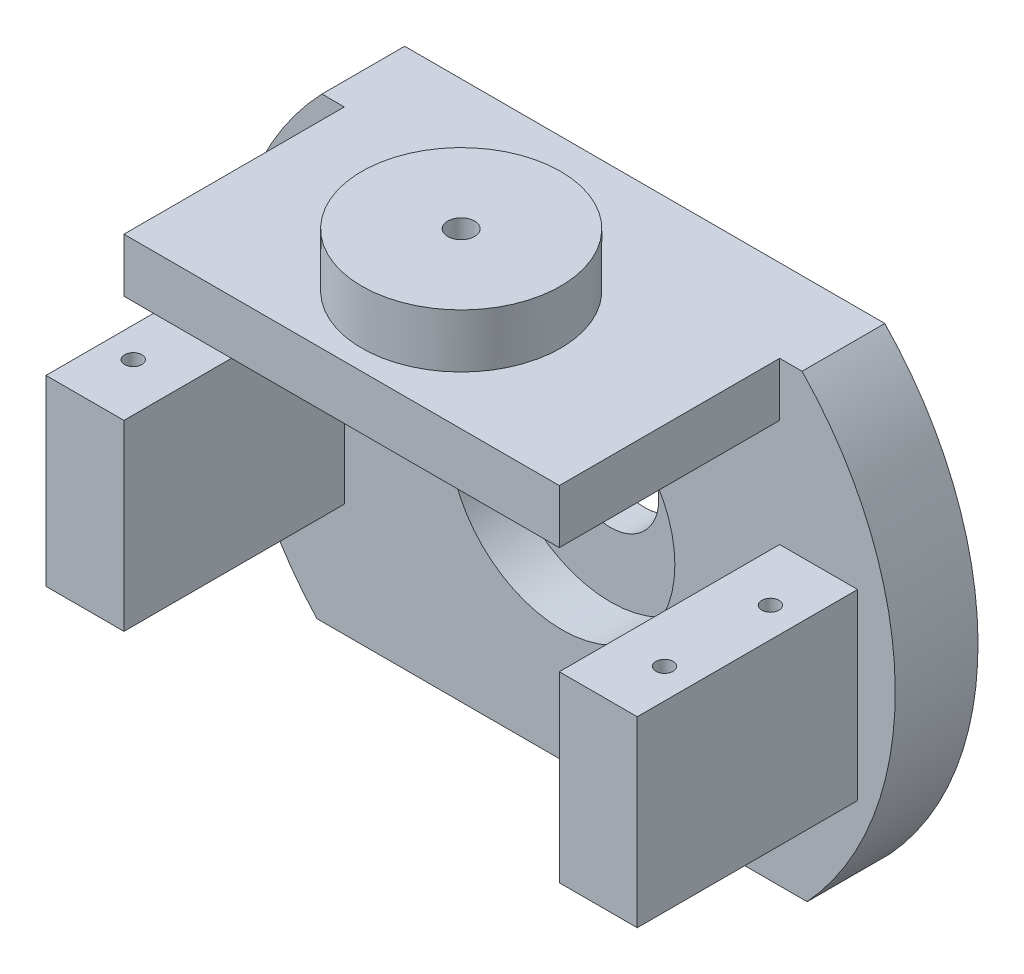
ISO-10303-21;
HEADER;
FILE_DESCRIPTION(('STEP AP214'),'2;1');
FILE_NAME('part.step','',(''),(''),'','','');
FILE_SCHEMA(('AUTOMOTIVE_DESIGN { 1 0 10303 214 1 1 1 1 }'));
ENDSEC;
DATA;
#1=APPLICATION_CONTEXT('core data for automotive mechanical design processes');
#2=APPLICATION_PROTOCOL_DEFINITION('international standard','automotive_design',2000,#1);
#3=PRODUCT_CONTEXT('',#1,'mechanical');
#4=PRODUCT('Part','Part','',(#3));
#5=PRODUCT_RELATED_PRODUCT_CATEGORY('part','',(#4));
#6=PRODUCT_DEFINITION_FORMATION('','',#4);
#7=PRODUCT_DEFINITION_CONTEXT('part definition',#1,'design');
#8=PRODUCT_DEFINITION('design','',#6,#7);
#9=PRODUCT_DEFINITION_SHAPE('','',#8);
#10=(LENGTH_UNIT() NAMED_UNIT(*) SI_UNIT(.MILLI.,.METRE.));
#11=(NAMED_UNIT(*) PLANE_ANGLE_UNIT() SI_UNIT($,.RADIAN.));
#12=(NAMED_UNIT(*) SI_UNIT($,.STERADIAN.) SOLID_ANGLE_UNIT());
#13=UNCERTAINTY_MEASURE_WITH_UNIT(LENGTH_MEASURE(1.E-05),#10,'distance_accuracy_value','');
#14=(GEOMETRIC_REPRESENTATION_CONTEXT(3) GLOBAL_UNCERTAINTY_ASSIGNED_CONTEXT((#13)) GLOBAL_UNIT_ASSIGNED_CONTEXT((#10,
#11,#12)) REPRESENTATION_CONTEXT('',''));
#15=CARTESIAN_POINT('',(0.,0.,0.));
#16=DIRECTION('',(0.,0.,1.));
#17=DIRECTION('',(1.,0.,0.));
#18=AXIS2_PLACEMENT_3D('',#15,#16,#17);
#19=CARTESIAN_POINT('',(0.,0.,94.1812408671319));
#20=DIRECTION('',(0.,0.,-1.));
#21=DIRECTION('',(-1.,0.,0.));
#22=AXIS2_PLACEMENT_3D('',#19,#20,#21);
#23=CYLINDRICAL_SURFACE('',#22,31.);
#24=DIRECTION('',(0.,0.,-1.));
#25=VECTOR('',#24,1.);
#26=CARTESIAN_POINT('',(-22.8035085019828,-21.,94.1812408671319));
#27=LINE('',#26,#25);
#28=CARTESIAN_POINT('',(-22.8035085019828,-21.,6.5));
#29=VERTEX_POINT('',#28);
#30=CARTESIAN_POINT('',(-22.8035085019828,-21.,-1.2));
#31=VERTEX_POINT('',#30);
#32=EDGE_CURVE('E60',#29,#31,#27,.T.);
#33=ORIENTED_EDGE('',*,*,#32,.F.);
#34=CARTESIAN_POINT('',(0.,0.,6.50000000000001));
#35=DIRECTION('',(0.,0.,-1.));
#36=DIRECTION('',(-1.,0.,0.));
#37=AXIS2_PLACEMENT_3D('',#34,#35,#36);
#38=CIRCLE('',#37,31.);
#39=CARTESIAN_POINT('',(-22.3327114341273,21.5,6.50000000000001));
#40=VERTEX_POINT('',#39);
#41=EDGE_CURVE('E229',#40,#29,#38,.F.);
#42=ORIENTED_EDGE('',*,*,#41,.F.);
#43=DIRECTION('',(0.,0.,-1.));
#44=VECTOR('',#43,1.);
#45=CARTESIAN_POINT('',(-22.3327114341273,21.5,94.1812408671319));
#46=LINE('',#45,#44);
#47=CARTESIAN_POINT('',(-22.3327114341273,21.5,-1.2));
#48=VERTEX_POINT('',#47);
#49=EDGE_CURVE('E54',#48,#40,#46,.F.);
#50=ORIENTED_EDGE('',*,*,#49,.F.);
#51=CARTESIAN_POINT('',(0.,0.,-1.2));
#52=DIRECTION('',(0.,0.,-1.));
#53=DIRECTION('',(-1.,0.,0.));
#54=AXIS2_PLACEMENT_3D('',#51,#52,#53);
#55=CIRCLE('',#54,31.);
#56=EDGE_CURVE('E168',#31,#48,#55,.T.);
#57=ORIENTED_EDGE('',*,*,#56,.F.);
#58=EDGE_LOOP('',(#33,#42,#50,#57));
#59=FACE_BOUND('',#58,.T.);
#60=ADVANCED_FACE('F45',(#59),#23,.T.);
#61=CARTESIAN_POINT('',(-20.25,67.4360851344404,6.5));
#62=DIRECTION('',(0.,0.,-1.));
#63=DIRECTION('',(-1.,0.,0.));
#64=AXIS2_PLACEMENT_3D('',#61,#62,#63);
#65=PLANE('',#64);
#66=CARTESIAN_POINT('',(0.,0.,6.5));
#67=DIRECTION('',(0.,0.,1.));
#68=DIRECTION('',(1.,0.,0.));
#69=AXIS2_PLACEMENT_3D('',#66,#67,#68);
#70=CIRCLE('',#69,10.5);
#71=CARTESIAN_POINT('',(10.5,0.,6.5));
#72=VERTEX_POINT('',#71);
#73=EDGE_CURVE('E201',#72,#72,#70,.T.);
#74=ORIENTED_EDGE('',*,*,#73,.F.);
#75=EDGE_LOOP('',(#74));
#76=FACE_BOUND('',#75,.T.);
#77=DIRECTION('',(-1.,0.,0.));
#78=VECTOR('',#77,1.);
#79=CARTESIAN_POINT('',(50.3089894559141,6.50000000000001,6.5));
#80=LINE('',#79,#78);
#81=CARTESIAN_POINT('',(27.5,6.50000000000001,6.5));
#82=VERTEX_POINT('',#81);
#83=CARTESIAN_POINT('',(20.25,6.50000000000001,6.5));
#84=VERTEX_POINT('',#83);
#85=EDGE_CURVE('E277',#82,#84,#80,.T.);
#86=ORIENTED_EDGE('',*,*,#85,.F.);
#87=DIRECTION('',(0.,-1.,0.));
#88=VECTOR('',#87,1.);
#89=CARTESIAN_POINT('',(27.5,21.5,6.5));
#90=LINE('',#89,#88);
#91=CARTESIAN_POINT('',(27.5,-10.5,6.5));
#92=VERTEX_POINT('',#91);
#93=EDGE_CURVE('E233',#82,#92,#90,.T.);
#94=ORIENTED_EDGE('',*,*,#93,.T.);
#95=DIRECTION('',(-1.,0.,0.));
#96=VECTOR('',#95,1.);
#97=CARTESIAN_POINT('',(-27.5,-10.5,6.5));
#98=LINE('',#97,#96);
#99=CARTESIAN_POINT('',(20.25,-10.5,6.5));
#100=VERTEX_POINT('',#99);
#101=EDGE_CURVE('E305',#92,#100,#98,.T.);
#102=ORIENTED_EDGE('',*,*,#101,.T.);
#103=DIRECTION('',(0.,-1.,0.));
#104=VECTOR('',#103,1.);
#105=CARTESIAN_POINT('',(20.25,67.4360851344404,6.5));
#106=LINE('',#105,#104);
#107=EDGE_CURVE('E318',#84,#100,#106,.T.);
#108=ORIENTED_EDGE('',*,*,#107,.F.);
#109=EDGE_LOOP('',(#86,#94,#102,#108));
#110=FACE_BOUND('',#109,.T.);
#111=ORIENTED_EDGE('',*,*,#41,.T.);
#112=DIRECTION('',(-1.,0.,0.));
#113=VECTOR('',#112,1.);
#114=CARTESIAN_POINT('',(26.5027413784262,-21.,6.5));
#115=LINE('',#114,#113);
#116=CARTESIAN_POINT('',(22.8035085019828,-21.,6.5));
#117=VERTEX_POINT('',#116);
#118=EDGE_CURVE('E381',#117,#29,#115,.T.);
#119=ORIENTED_EDGE('',*,*,#118,.F.);
#120=CARTESIAN_POINT('',(22.3327114341273,21.5,6.50000000000001));
#121=VERTEX_POINT('',#120);
#122=EDGE_CURVE('E68',#117,#121,#38,.F.);
#123=ORIENTED_EDGE('',*,*,#122,.T.);
#124=DIRECTION('',(1.,0.,0.));
#125=VECTOR('',#124,1.);
#126=CARTESIAN_POINT('',(-26.0407931939076,21.5,6.5));
#127=LINE('',#126,#125);
#128=CARTESIAN_POINT('',(20.25,21.5,6.5));
#129=VERTEX_POINT('',#128);
#130=EDGE_CURVE('E178',#129,#121,#127,.T.);
#131=ORIENTED_EDGE('',*,*,#130,.F.);
#132=DIRECTION('',(0.,-1.,0.));
#133=VECTOR('',#132,1.);
#134=CARTESIAN_POINT('',(20.25,43.2442521140645,6.5));
#135=LINE('',#134,#133);
#136=CARTESIAN_POINT('',(20.25,16.5,6.5));
#137=VERTEX_POINT('',#136);
#138=EDGE_CURVE('E262',#129,#137,#135,.T.);
#139=ORIENTED_EDGE('',*,*,#138,.T.);
#140=DIRECTION('',(-1.,0.,0.));
#141=VECTOR('',#140,1.);
#142=CARTESIAN_POINT('',(-20.25,16.5,6.5));
#143=LINE('',#142,#141);
#144=CARTESIAN_POINT('',(-20.25,16.5,6.5));
#145=VERTEX_POINT('',#144);
#146=EDGE_CURVE('E321',#137,#145,#143,.T.);
#147=ORIENTED_EDGE('',*,*,#146,.T.);
#148=DIRECTION('',(0.,-1.,0.));
#149=VECTOR('',#148,1.);
#150=CARTESIAN_POINT('',(-20.25,43.2442521140645,6.5));
#151=LINE('',#150,#149);
#152=CARTESIAN_POINT('',(-20.25,21.5,6.5));
#153=VERTEX_POINT('',#152);
#154=EDGE_CURVE('E250',#153,#145,#151,.T.);
#155=ORIENTED_EDGE('',*,*,#154,.F.);
#156=EDGE_CURVE('E184',#40,#153,#127,.T.);
#157=ORIENTED_EDGE('',*,*,#156,.F.);
#158=EDGE_LOOP('',(#111,#119,#123,#131,#139,#147,#155,#157));
#159=FACE_BOUND('',#158,.T.);
#160=CARTESIAN_POINT('',(-20.25,-10.5,6.5));
#161=VERTEX_POINT('',#160);
#162=CARTESIAN_POINT('',(-27.5,-10.5,6.5));
#163=VERTEX_POINT('',#162);
#164=EDGE_CURVE('E304',#161,#163,#98,.T.);
#165=ORIENTED_EDGE('',*,*,#164,.T.);
#166=DIRECTION('',(0.,1.,0.));
#167=VECTOR('',#166,1.);
#168=CARTESIAN_POINT('',(-27.5,21.5,6.5));
#169=LINE('',#168,#167);
#170=CARTESIAN_POINT('',(-27.5,6.5,6.5));
#171=VERTEX_POINT('',#170);
#172=EDGE_CURVE('E237',#163,#171,#169,.T.);
#173=ORIENTED_EDGE('',*,*,#172,.T.);
#174=CARTESIAN_POINT('',(-20.25,6.5,6.5));
#175=VERTEX_POINT('',#174);
#176=EDGE_CURVE('E270',#175,#171,#80,.T.);
#177=ORIENTED_EDGE('',*,*,#176,.F.);
#178=DIRECTION('',(0.,-1.,0.));
#179=VECTOR('',#178,1.);
#180=CARTESIAN_POINT('',(-20.25,67.4360851344404,6.5));
#181=LINE('',#180,#179);
#182=EDGE_CURVE('E317',#175,#161,#181,.T.);
#183=ORIENTED_EDGE('',*,*,#182,.T.);
#184=EDGE_LOOP('',(#165,#173,#177,#183));
#185=FACE_BOUND('',#184,.T.);
#186=ADVANCED_FACE('F377',(#76,#110,#159,#185),#65,.F.);
#187=CARTESIAN_POINT('',(27.5,21.5,27.));
#188=DIRECTION('',(-1.,0.,0.));
#189=DIRECTION('',(0.,-1.,0.));
#190=AXIS2_PLACEMENT_3D('',#187,#188,#189);
#191=PLANE('',#190);
#192=ORIENTED_EDGE('',*,*,#93,.F.);
#193=DIRECTION('',(0.,0.,-1.));
#194=VECTOR('',#193,1.);
#195=CARTESIAN_POINT('',(27.5,6.50000000000001,6.5));
#196=LINE('',#195,#194);
#197=CARTESIAN_POINT('',(27.5,6.50000000000001,27.));
#198=VERTEX_POINT('',#197);
#199=EDGE_CURVE('E275',#198,#82,#196,.T.);
#200=ORIENTED_EDGE('',*,*,#199,.F.);
#201=DIRECTION('',(0.,1.,0.));
#202=VECTOR('',#201,1.);
#203=CARTESIAN_POINT('',(27.5,21.5,27.));
#204=LINE('',#203,#202);
#205=CARTESIAN_POINT('',(27.5,-10.5,27.));
#206=VERTEX_POINT('',#205);
#207=EDGE_CURVE('E327',#206,#198,#204,.T.);
#208=ORIENTED_EDGE('',*,*,#207,.F.);
#209=DIRECTION('',(0.,0.,-1.));
#210=VECTOR('',#209,1.);
#211=CARTESIAN_POINT('',(27.5,-10.5,27.));
#212=LINE('',#211,#210);
#213=EDGE_CURVE('E291',#206,#92,#212,.T.);
#214=ORIENTED_EDGE('',*,*,#213,.T.);
#215=EDGE_LOOP('',(#192,#200,#208,#214));
#216=FACE_BOUND('',#215,.T.);
#217=ADVANCED_FACE('F47',(#216),#191,.F.);
#218=CARTESIAN_POINT('',(-27.5,21.5,27.));
#219=DIRECTION('',(0.,-1.,0.));
#220=DIRECTION('',(0.,0.,-1.));
#221=AXIS2_PLACEMENT_3D('',#218,#219,#220);
#222=PLANE('',#221);
#223=CARTESIAN_POINT('',(0.,21.5,15.8768229827015));
#224=DIRECTION('',(0.,-1.,0.));
#225=DIRECTION('',(0.,0.,-1.));
#226=AXIS2_PLACEMENT_3D('',#223,#224,#225);
#227=CIRCLE('',#226,9.25);
#228=CARTESIAN_POINT('',(0.,21.5,6.62682298270155));
#229=VERTEX_POINT('',#228);
#230=EDGE_CURVE('E349',#229,#229,#227,.F.);
#231=ORIENTED_EDGE('',*,*,#230,.F.);
#232=EDGE_LOOP('',(#231));
#233=FACE_BOUND('',#232,.T.);
#234=DIRECTION('',(0.,0.,1.));
#235=VECTOR('',#234,1.);
#236=CARTESIAN_POINT('',(20.25,21.5,27.));
#237=LINE('',#236,#235);
#238=CARTESIAN_POINT('',(20.25,21.5,27.));
#239=VERTEX_POINT('',#238);
#240=EDGE_CURVE('E251',#129,#239,#237,.T.);
#241=ORIENTED_EDGE('',*,*,#240,.F.);
#242=ORIENTED_EDGE('',*,*,#130,.T.);
#243=DIRECTION('',(0.,0.,-1.));
#244=VECTOR('',#243,1.);
#245=CARTESIAN_POINT('',(22.3327114341273,21.5,94.1812408671319));
#246=LINE('',#245,#244);
#247=CARTESIAN_POINT('',(22.3327114341273,21.5,-1.2));
#248=VERTEX_POINT('',#247);
#249=EDGE_CURVE('E365',#121,#248,#246,.T.);
#250=ORIENTED_EDGE('',*,*,#249,.T.);
#251=DIRECTION('',(1.,0.,0.));
#252=VECTOR('',#251,1.);
#253=CARTESIAN_POINT('',(22.3327114341273,21.5,-1.2));
#254=LINE('',#253,#252);
#255=EDGE_CURVE('E173',#48,#248,#254,.T.);
#256=ORIENTED_EDGE('',*,*,#255,.F.);
#257=ORIENTED_EDGE('',*,*,#49,.T.);
#258=ORIENTED_EDGE('',*,*,#156,.T.);
#259=DIRECTION('',(0.,0.,-1.));
#260=VECTOR('',#259,1.);
#261=CARTESIAN_POINT('',(-20.25,21.5,27.));
#262=LINE('',#261,#260);
#263=CARTESIAN_POINT('',(-20.25,21.5,27.));
#264=VERTEX_POINT('',#263);
#265=EDGE_CURVE('E241',#264,#153,#262,.T.);
#266=ORIENTED_EDGE('',*,*,#265,.F.);
#267=DIRECTION('',(-1.,0.,0.));
#268=VECTOR('',#267,1.);
#269=CARTESIAN_POINT('',(-27.5,21.5,27.));
#270=LINE('',#269,#268);
#271=EDGE_CURVE('E331',#239,#264,#270,.T.);
#272=ORIENTED_EDGE('',*,*,#271,.F.);
#273=EDGE_LOOP('',(#241,#242,#250,#256,#257,#258,#266,#272));
#274=FACE_BOUND('',#273,.T.);
#275=ADVANCED_FACE('F372',(#233,#274),#222,.F.);
#276=CARTESIAN_POINT('',(-27.5,21.5,27.));
#277=DIRECTION('',(1.,0.,0.));
#278=DIRECTION('',(0.,1.,0.));
#279=AXIS2_PLACEMENT_3D('',#276,#277,#278);
#280=PLANE('',#279);
#281=ORIENTED_EDGE('',*,*,#172,.F.);
#282=DIRECTION('',(0.,0.,1.));
#283=VECTOR('',#282,1.);
#284=CARTESIAN_POINT('',(-27.5,-10.5,27.));
#285=LINE('',#284,#283);
#286=CARTESIAN_POINT('',(-27.5,-10.5,27.));
#287=VERTEX_POINT('',#286);
#288=EDGE_CURVE('E300',#163,#287,#285,.T.);
#289=ORIENTED_EDGE('',*,*,#288,.T.);
#290=DIRECTION('',(0.,-1.,0.));
#291=VECTOR('',#290,1.);
#292=CARTESIAN_POINT('',(-27.5,21.5,27.));
#293=LINE('',#292,#291);
#294=CARTESIAN_POINT('',(-27.5,6.5,27.));
#295=VERTEX_POINT('',#294);
#296=EDGE_CURVE('E335',#295,#287,#293,.T.);
#297=ORIENTED_EDGE('',*,*,#296,.F.);
#298=DIRECTION('',(0.,0.,1.));
#299=VECTOR('',#298,1.);
#300=CARTESIAN_POINT('',(-27.5,6.5,6.5));
#301=LINE('',#300,#299);
#302=EDGE_CURVE('E245',#171,#295,#301,.T.);
#303=ORIENTED_EDGE('',*,*,#302,.F.);
#304=EDGE_LOOP('',(#281,#289,#297,#303));
#305=FACE_BOUND('',#304,.T.);
#306=ADVANCED_FACE('F465',(#305),#280,.F.);
#307=CARTESIAN_POINT('',(0.,0.,27.));
#308=DIRECTION('',(0.,0.,1.));
#309=DIRECTION('',(1.,0.,0.));
#310=AXIS2_PLACEMENT_3D('',#307,#308,#309);
#311=PLANE('',#310);
#312=DIRECTION('',(0.,-1.,0.));
#313=VECTOR('',#312,1.);
#314=CARTESIAN_POINT('',(-20.25,43.2442521140645,27.));
#315=LINE('',#314,#313);
#316=CARTESIAN_POINT('',(-20.25,16.5,27.));
#317=VERTEX_POINT('',#316);
#318=EDGE_CURVE('E246',#264,#317,#315,.T.);
#319=ORIENTED_EDGE('',*,*,#318,.T.);
#320=DIRECTION('',(1.,0.,0.));
#321=VECTOR('',#320,1.);
#322=CARTESIAN_POINT('',(0.,16.5,27.));
#323=LINE('',#322,#321);
#324=CARTESIAN_POINT('',(20.25,16.5,27.));
#325=VERTEX_POINT('',#324);
#326=EDGE_CURVE('E338',#317,#325,#323,.T.);
#327=ORIENTED_EDGE('',*,*,#326,.T.);
#328=DIRECTION('',(0.,-1.,0.));
#329=VECTOR('',#328,1.);
#330=CARTESIAN_POINT('',(20.25,43.2442521140645,27.));
#331=LINE('',#330,#329);
#332=EDGE_CURVE('E259',#239,#325,#331,.T.);
#333=ORIENTED_EDGE('',*,*,#332,.F.);
#334=ORIENTED_EDGE('',*,*,#271,.T.);
#335=EDGE_LOOP('',(#319,#327,#333,#334));
#336=FACE_BOUND('',#335,.T.);
#337=ADVANCED_FACE('F464',(#336),#311,.T.);
#338=DIRECTION('',(-1.,0.,0.));
#339=VECTOR('',#338,1.);
#340=CARTESIAN_POINT('',(50.3089894559141,6.50000000000001,27.));
#341=LINE('',#340,#339);
#342=CARTESIAN_POINT('',(-20.25,6.5,27.));
#343=VERTEX_POINT('',#342);
#344=EDGE_CURVE('E276',#343,#295,#341,.T.);
#345=ORIENTED_EDGE('',*,*,#344,.T.);
#346=ORIENTED_EDGE('',*,*,#296,.T.);
#347=DIRECTION('',(1.,0.,0.));
#348=VECTOR('',#347,1.);
#349=CARTESIAN_POINT('',(-27.5,-10.5,27.));
#350=LINE('',#349,#348);
#351=CARTESIAN_POINT('',(-20.25,-10.5,27.));
#352=VERTEX_POINT('',#351);
#353=EDGE_CURVE('E296',#287,#352,#350,.T.);
#354=ORIENTED_EDGE('',*,*,#353,.T.);
#355=DIRECTION('',(0.,-1.,0.));
#356=VECTOR('',#355,1.);
#357=CARTESIAN_POINT('',(-20.25,0.,27.));
#358=LINE('',#357,#356);
#359=EDGE_CURVE('E346',#343,#352,#358,.T.);
#360=ORIENTED_EDGE('',*,*,#359,.F.);
#361=EDGE_LOOP('',(#345,#346,#354,#360));
#362=FACE_BOUND('',#361,.T.);
#363=ADVANCED_FACE('F462',(#362),#311,.T.);
#364=CARTESIAN_POINT('',(20.25,6.50000000000001,27.));
#365=VERTEX_POINT('',#364);
#366=EDGE_CURVE('E271',#198,#365,#341,.T.);
#367=ORIENTED_EDGE('',*,*,#366,.T.);
#368=DIRECTION('',(0.,1.,0.));
#369=VECTOR('',#368,1.);
#370=CARTESIAN_POINT('',(20.25,0.,27.));
#371=LINE('',#370,#369);
#372=CARTESIAN_POINT('',(20.25,-10.5,27.));
#373=VERTEX_POINT('',#372);
#374=EDGE_CURVE('E342',#373,#365,#371,.T.);
#375=ORIENTED_EDGE('',*,*,#374,.F.);
#376=EDGE_CURVE('E295',#373,#206,#350,.T.);
#377=ORIENTED_EDGE('',*,*,#376,.T.);
#378=ORIENTED_EDGE('',*,*,#207,.T.);
#379=EDGE_LOOP('',(#367,#375,#377,#378));
#380=FACE_BOUND('',#379,.T.);
#381=ADVANCED_FACE('F458',(#380),#311,.T.);
#382=CARTESIAN_POINT('',(-20.25,67.4360851344404,6.5));
#383=DIRECTION('',(-1.,0.,0.));
#384=DIRECTION('',(0.,0.,1.));
#385=AXIS2_PLACEMENT_3D('',#382,#383,#384);
#386=PLANE('',#385);
#387=ORIENTED_EDGE('',*,*,#182,.F.);
#388=DIRECTION('',(0.,0.,1.));
#389=VECTOR('',#388,1.);
#390=CARTESIAN_POINT('',(-20.25,6.5,6.5));
#391=LINE('',#390,#389);
#392=EDGE_CURVE('E287',#175,#343,#391,.T.);
#393=ORIENTED_EDGE('',*,*,#392,.T.);
#394=ORIENTED_EDGE('',*,*,#359,.T.);
#395=DIRECTION('',(0.,0.,1.));
#396=VECTOR('',#395,1.);
#397=CARTESIAN_POINT('',(-20.25,-10.5,6.5));
#398=LINE('',#397,#396);
#399=EDGE_CURVE('E313',#161,#352,#398,.T.);
#400=ORIENTED_EDGE('',*,*,#399,.F.);
#401=EDGE_LOOP('',(#387,#393,#394,#400));
#402=FACE_BOUND('',#401,.T.);
#403=ADVANCED_FACE('F453',(#402),#386,.F.);
#404=CARTESIAN_POINT('',(20.25,67.4360851344404,6.5));
#405=DIRECTION('',(1.,0.,0.));
#406=DIRECTION('',(0.,0.,-1.));
#407=AXIS2_PLACEMENT_3D('',#404,#405,#406);
#408=PLANE('',#407);
#409=ORIENTED_EDGE('',*,*,#374,.T.);
#410=DIRECTION('',(0.,0.,-1.));
#411=VECTOR('',#410,1.);
#412=CARTESIAN_POINT('',(20.25,6.50000000000001,6.5));
#413=LINE('',#412,#411);
#414=EDGE_CURVE('E283',#365,#84,#413,.T.);
#415=ORIENTED_EDGE('',*,*,#414,.T.);
#416=ORIENTED_EDGE('',*,*,#107,.T.);
#417=DIRECTION('',(0.,0.,-1.));
#418=VECTOR('',#417,1.);
#419=CARTESIAN_POINT('',(20.25,-10.5,6.5));
#420=LINE('',#419,#418);
#421=EDGE_CURVE('E309',#373,#100,#420,.T.);
#422=ORIENTED_EDGE('',*,*,#421,.F.);
#423=EDGE_LOOP('',(#409,#415,#416,#422));
#424=FACE_BOUND('',#423,.T.);
#425=ADVANCED_FACE('F450',(#424),#408,.F.);
#426=CARTESIAN_POINT('',(-27.5,16.5,27.));
#427=DIRECTION('',(0.,-1.,0.));
#428=DIRECTION('',(0.,0.,-1.));
#429=AXIS2_PLACEMENT_3D('',#426,#427,#428);
#430=PLANE('',#429);
#431=DIRECTION('',(0.,0.,1.));
#432=VECTOR('',#431,1.);
#433=CARTESIAN_POINT('',(-20.25,16.5,27.));
#434=LINE('',#433,#432);
#435=EDGE_CURVE('E247',#145,#317,#434,.T.);
#436=ORIENTED_EDGE('',*,*,#435,.F.);
#437=ORIENTED_EDGE('',*,*,#146,.F.);
#438=DIRECTION('',(0.,0.,-1.));
#439=VECTOR('',#438,1.);
#440=CARTESIAN_POINT('',(20.25,16.5,27.));
#441=LINE('',#440,#439);
#442=EDGE_CURVE('E240',#325,#137,#441,.T.);
#443=ORIENTED_EDGE('',*,*,#442,.F.);
#444=ORIENTED_EDGE('',*,*,#326,.F.);
#445=EDGE_LOOP('',(#436,#437,#443,#444));
#446=FACE_BOUND('',#445,.T.);
#447=ADVANCED_FACE('F447',(#446),#430,.T.);
#448=CARTESIAN_POINT('',(-27.5,-10.5,27.));
#449=DIRECTION('',(0.,-1.,0.));
#450=DIRECTION('',(0.,0.,-1.));
#451=AXIS2_PLACEMENT_3D('',#448,#449,#450);
#452=PLANE('',#451);
#453=CARTESIAN_POINT('',(24.71,-10.5,21.675));
#454=DIRECTION('',(0.,-1.,0.));
#455=DIRECTION('',(0.,0.,-1.));
#456=AXIS2_PLACEMENT_3D('',#453,#454,#455);
#457=CIRCLE('',#456,0.799999999999995);
#458=CARTESIAN_POINT('',(24.71,-10.5,20.875));
#459=VERTEX_POINT('',#458);
#460=EDGE_CURVE('E219',#459,#459,#457,.T.);
#461=ORIENTED_EDGE('',*,*,#460,.F.);
#462=EDGE_LOOP('',(#461));
#463=FACE_BOUND('',#462,.T.);
#464=CARTESIAN_POINT('',(24.71,-10.5,11.825));
#465=DIRECTION('',(0.,-1.,0.));
#466=DIRECTION('',(0.,0.,-1.));
#467=AXIS2_PLACEMENT_3D('',#464,#465,#466);
#468=CIRCLE('',#467,0.799999999999995);
#469=CARTESIAN_POINT('',(24.71,-10.5,11.025));
#470=VERTEX_POINT('',#469);
#471=EDGE_CURVE('E224',#470,#470,#468,.T.);
#472=ORIENTED_EDGE('',*,*,#471,.F.);
#473=EDGE_LOOP('',(#472));
#474=FACE_BOUND('',#473,.T.);
#475=ORIENTED_EDGE('',*,*,#421,.T.);
#476=ORIENTED_EDGE('',*,*,#101,.F.);
#477=ORIENTED_EDGE('',*,*,#213,.F.);
#478=ORIENTED_EDGE('',*,*,#376,.F.);
#479=EDGE_LOOP('',(#475,#476,#477,#478));
#480=FACE_BOUND('',#479,.T.);
#481=ADVANCED_FACE('F445',(#463,#474,#480),#452,.T.);
#482=CARTESIAN_POINT('',(-24.71,-10.5,21.675));
#483=DIRECTION('',(0.,-1.,0.));
#484=DIRECTION('',(0.,0.,-1.));
#485=AXIS2_PLACEMENT_3D('',#482,#483,#484);
#486=CIRCLE('',#485,0.799999999999995);
#487=CARTESIAN_POINT('',(-24.71,-10.5,20.875));
#488=VERTEX_POINT('',#487);
#489=EDGE_CURVE('E209',#488,#488,#486,.T.);
#490=ORIENTED_EDGE('',*,*,#489,.F.);
#491=EDGE_LOOP('',(#490));
#492=FACE_BOUND('',#491,.T.);
#493=CARTESIAN_POINT('',(-24.71,-10.5,11.825));
#494=DIRECTION('',(0.,-1.,0.));
#495=DIRECTION('',(0.,0.,-1.));
#496=AXIS2_PLACEMENT_3D('',#493,#494,#495);
#497=CIRCLE('',#496,0.799999999999995);
#498=CARTESIAN_POINT('',(-24.71,-10.5,11.025));
#499=VERTEX_POINT('',#498);
#500=EDGE_CURVE('E214',#499,#499,#497,.T.);
#501=ORIENTED_EDGE('',*,*,#500,.F.);
#502=EDGE_LOOP('',(#501));
#503=FACE_BOUND('',#502,.T.);
#504=ORIENTED_EDGE('',*,*,#399,.T.);
#505=ORIENTED_EDGE('',*,*,#353,.F.);
#506=ORIENTED_EDGE('',*,*,#288,.F.);
#507=ORIENTED_EDGE('',*,*,#164,.F.);
#508=EDGE_LOOP('',(#504,#505,#506,#507));
#509=FACE_BOUND('',#508,.T.);
#510=ADVANCED_FACE('F441',(#492,#503,#509),#452,.T.);
#511=CARTESIAN_POINT('',(50.3089894559141,6.50000000000001,6.5));
#512=DIRECTION('',(0.,-1.,0.));
#513=DIRECTION('',(1.,0.,0.));
#514=AXIS2_PLACEMENT_3D('',#511,#512,#513);
#515=PLANE('',#514);
#516=CARTESIAN_POINT('',(-24.71,6.5,21.675));
#517=DIRECTION('',(0.,-1.,0.));
#518=DIRECTION('',(1.,0.,0.));
#519=AXIS2_PLACEMENT_3D('',#516,#517,#518);
#520=CIRCLE('',#519,0.799999999999992);
#521=CARTESIAN_POINT('',(-23.91,6.5,21.675));
#522=VERTEX_POINT('',#521);
#523=EDGE_CURVE('E213',#522,#522,#520,.T.);
#524=ORIENTED_EDGE('',*,*,#523,.T.);
#525=EDGE_LOOP('',(#524));
#526=FACE_BOUND('',#525,.T.);
#527=CARTESIAN_POINT('',(-24.71,6.5,11.825));
#528=DIRECTION('',(0.,-1.,0.));
#529=DIRECTION('',(1.,0.,0.));
#530=AXIS2_PLACEMENT_3D('',#527,#528,#529);
#531=CIRCLE('',#530,0.799999999999992);
#532=CARTESIAN_POINT('',(-23.91,6.5,11.825));
#533=VERTEX_POINT('',#532);
#534=EDGE_CURVE('E218',#533,#533,#531,.T.);
#535=ORIENTED_EDGE('',*,*,#534,.T.);
#536=EDGE_LOOP('',(#535));
#537=FACE_BOUND('',#536,.T.);
#538=ORIENTED_EDGE('',*,*,#176,.T.);
#539=ORIENTED_EDGE('',*,*,#302,.T.);
#540=ORIENTED_EDGE('',*,*,#344,.F.);
#541=ORIENTED_EDGE('',*,*,#392,.F.);
#542=EDGE_LOOP('',(#538,#539,#540,#541));
#543=FACE_BOUND('',#542,.T.);
#544=ADVANCED_FACE('F438',(#526,#537,#543),#515,.F.);
#545=CARTESIAN_POINT('',(24.71,6.50000000000001,21.675));
#546=DIRECTION('',(0.,-1.,0.));
#547=DIRECTION('',(1.,0.,0.));
#548=AXIS2_PLACEMENT_3D('',#545,#546,#547);
#549=CIRCLE('',#548,0.799999999999992);
#550=CARTESIAN_POINT('',(25.51,6.50000000000001,21.675));
#551=VERTEX_POINT('',#550);
#552=EDGE_CURVE('E223',#551,#551,#549,.T.);
#553=ORIENTED_EDGE('',*,*,#552,.T.);
#554=EDGE_LOOP('',(#553));
#555=FACE_BOUND('',#554,.T.);
#556=CARTESIAN_POINT('',(24.71,6.50000000000001,11.825));
#557=DIRECTION('',(0.,-1.,0.));
#558=DIRECTION('',(1.,0.,0.));
#559=AXIS2_PLACEMENT_3D('',#556,#557,#558);
#560=CIRCLE('',#559,0.799999999999992);
#561=CARTESIAN_POINT('',(25.51,6.50000000000001,11.825));
#562=VERTEX_POINT('',#561);
#563=EDGE_CURVE('E228',#562,#562,#560,.T.);
#564=ORIENTED_EDGE('',*,*,#563,.T.);
#565=EDGE_LOOP('',(#564));
#566=FACE_BOUND('',#565,.T.);
#567=ORIENTED_EDGE('',*,*,#366,.F.);
#568=ORIENTED_EDGE('',*,*,#199,.T.);
#569=ORIENTED_EDGE('',*,*,#85,.T.);
#570=ORIENTED_EDGE('',*,*,#414,.F.);
#571=EDGE_LOOP('',(#567,#568,#569,#570));
#572=FACE_BOUND('',#571,.T.);
#573=ADVANCED_FACE('F434',(#555,#566,#572),#515,.F.);
#574=CARTESIAN_POINT('',(20.25,43.2442521140645,27.));
#575=DIRECTION('',(-1.,0.,0.));
#576=DIRECTION('',(0.,0.,1.));
#577=AXIS2_PLACEMENT_3D('',#574,#575,#576);
#578=PLANE('',#577);
#579=ORIENTED_EDGE('',*,*,#240,.T.);
#580=ORIENTED_EDGE('',*,*,#332,.T.);
#581=ORIENTED_EDGE('',*,*,#442,.T.);
#582=ORIENTED_EDGE('',*,*,#138,.F.);
#583=EDGE_LOOP('',(#579,#580,#581,#582));
#584=FACE_BOUND('',#583,.T.);
#585=ADVANCED_FACE('F429',(#584),#578,.F.);
#586=CARTESIAN_POINT('',(-20.25,43.2442521140645,27.));
#587=DIRECTION('',(1.,0.,0.));
#588=DIRECTION('',(0.,0.,-1.));
#589=AXIS2_PLACEMENT_3D('',#586,#587,#588);
#590=PLANE('',#589);
#591=ORIENTED_EDGE('',*,*,#265,.T.);
#592=ORIENTED_EDGE('',*,*,#154,.T.);
#593=ORIENTED_EDGE('',*,*,#435,.T.);
#594=ORIENTED_EDGE('',*,*,#318,.F.);
#595=EDGE_LOOP('',(#591,#592,#593,#594));
#596=FACE_BOUND('',#595,.T.);
#597=ADVANCED_FACE('F421',(#596),#590,.F.);
#598=DIRECTION('',(0.,0.,-1.));
#599=VECTOR('',#598,1.);
#600=CARTESIAN_POINT('',(22.8035085019828,-21.,94.1812408671319));
#601=LINE('',#600,#599);
#602=CARTESIAN_POINT('',(22.8035085019828,-21.,-1.2));
#603=VERTEX_POINT('',#602);
#604=EDGE_CURVE('E158',#603,#117,#601,.F.);
#605=ORIENTED_EDGE('',*,*,#604,.F.);
#606=EDGE_CURVE('E166',#248,#603,#55,.T.);
#607=ORIENTED_EDGE('',*,*,#606,.F.);
#608=ORIENTED_EDGE('',*,*,#249,.F.);
#609=ORIENTED_EDGE('',*,*,#122,.F.);
#610=EDGE_LOOP('',(#605,#607,#608,#609));
#611=FACE_BOUND('',#610,.T.);
#612=ADVANCED_FACE('F164',(#611),#23,.T.);
#613=CARTESIAN_POINT('',(24.71,-10.5,11.825));
#614=DIRECTION('',(0.,-1.,0.));
#615=DIRECTION('',(0.,0.,-1.));
#616=AXIS2_PLACEMENT_3D('',#613,#614,#615);
#617=CYLINDRICAL_SURFACE('',#616,0.799999999999992);
#618=ORIENTED_EDGE('',*,*,#471,.T.);
#619=EDGE_LOOP('',(#618));
#620=FACE_BOUND('',#619,.T.);
#621=ORIENTED_EDGE('',*,*,#563,.F.);
#622=EDGE_LOOP('',(#621));
#623=FACE_BOUND('',#622,.T.);
#624=ADVANCED_FACE('F420',(#620,#623),#617,.F.);
#625=CARTESIAN_POINT('',(24.71,-10.5,21.675));
#626=DIRECTION('',(0.,-1.,0.));
#627=DIRECTION('',(0.,0.,-1.));
#628=AXIS2_PLACEMENT_3D('',#625,#626,#627);
#629=CYLINDRICAL_SURFACE('',#628,0.799999999999992);
#630=ORIENTED_EDGE('',*,*,#460,.T.);
#631=EDGE_LOOP('',(#630));
#632=FACE_BOUND('',#631,.T.);
#633=ORIENTED_EDGE('',*,*,#552,.F.);
#634=EDGE_LOOP('',(#633));
#635=FACE_BOUND('',#634,.T.);
#636=ADVANCED_FACE('F426',(#632,#635),#629,.F.);
#637=CARTESIAN_POINT('',(-24.71,-10.5,11.825));
#638=DIRECTION('',(0.,-1.,0.));
#639=DIRECTION('',(0.,0.,-1.));
#640=AXIS2_PLACEMENT_3D('',#637,#638,#639);
#641=CYLINDRICAL_SURFACE('',#640,0.799999999999992);
#642=ORIENTED_EDGE('',*,*,#500,.T.);
#643=EDGE_LOOP('',(#642));
#644=FACE_BOUND('',#643,.T.);
#645=ORIENTED_EDGE('',*,*,#534,.F.);
#646=EDGE_LOOP('',(#645));
#647=FACE_BOUND('',#646,.T.);
#648=ADVANCED_FACE('F581',(#644,#647),#641,.F.);
#649=CARTESIAN_POINT('',(-24.71,-10.5,21.675));
#650=DIRECTION('',(0.,-1.,0.));
#651=DIRECTION('',(0.,0.,-1.));
#652=AXIS2_PLACEMENT_3D('',#649,#650,#651);
#653=CYLINDRICAL_SURFACE('',#652,0.799999999999992);
#654=ORIENTED_EDGE('',*,*,#489,.T.);
#655=EDGE_LOOP('',(#654));
#656=FACE_BOUND('',#655,.T.);
#657=ORIENTED_EDGE('',*,*,#523,.F.);
#658=EDGE_LOOP('',(#657));
#659=FACE_BOUND('',#658,.T.);
#660=ADVANCED_FACE('F570',(#656,#659),#653,.F.);
#661=CARTESIAN_POINT('',(0.,0.,-29.698484809835));
#662=DIRECTION('',(0.,0.,1.));
#663=DIRECTION('',(1.,0.,0.));
#664=AXIS2_PLACEMENT_3D('',#661,#662,#663);
#665=CYLINDRICAL_SURFACE('',#664,10.5);
#666=CARTESIAN_POINT('',(0.,0.,2.));
#667=DIRECTION('',(0.,0.,1.));
#668=DIRECTION('',(1.,0.,0.));
#669=AXIS2_PLACEMENT_3D('',#666,#667,#668);
#670=CIRCLE('',#669,10.5);
#671=CARTESIAN_POINT('',(10.5,0.,2.));
#672=VERTEX_POINT('',#671);
#673=EDGE_CURVE('E205',#672,#672,#670,.F.);
#674=ORIENTED_EDGE('',*,*,#673,.T.);
#675=EDGE_LOOP('',(#674));
#676=FACE_BOUND('',#675,.T.);
#677=ORIENTED_EDGE('',*,*,#73,.T.);
#678=EDGE_LOOP('',(#677));
#679=FACE_BOUND('',#678,.T.);
#680=ADVANCED_FACE('F405',(#676,#679),#665,.F.);
#681=CARTESIAN_POINT('',(0.,0.,2.));
#682=DIRECTION('',(0.,0.,1.));
#683=DIRECTION('',(1.,0.,0.));
#684=AXIS2_PLACEMENT_3D('',#681,#682,#683);
#685=PLANE('',#684);
#686=CARTESIAN_POINT('',(0.,0.,2.));
#687=DIRECTION('',(0.,0.,1.));
#688=DIRECTION('',(1.,0.,0.));
#689=AXIS2_PLACEMENT_3D('',#686,#687,#688);
#690=CIRCLE('',#689,4.5);
#691=CARTESIAN_POINT('',(4.5,0.,2.));
#692=VERTEX_POINT('',#691);
#693=EDGE_CURVE('E197',#692,#692,#690,.T.);
#694=ORIENTED_EDGE('',*,*,#693,.F.);
#695=EDGE_LOOP('',(#694));
#696=FACE_BOUND('',#695,.T.);
#697=ORIENTED_EDGE('',*,*,#673,.F.);
#698=EDGE_LOOP('',(#697));
#699=FACE_BOUND('',#698,.T.);
#700=ADVANCED_FACE('F394',(#696,#699),#685,.T.);
#701=CARTESIAN_POINT('',(0.,0.,-12.7279220613579));
#702=DIRECTION('',(0.,0.,1.));
#703=DIRECTION('',(1.,0.,0.));
#704=AXIS2_PLACEMENT_3D('',#701,#702,#703);
#705=CYLINDRICAL_SURFACE('',#704,4.5);
#706=ORIENTED_EDGE('',*,*,#693,.T.);
#707=EDGE_LOOP('',(#706));
#708=FACE_BOUND('',#707,.T.);
#709=CARTESIAN_POINT('',(0.,0.,-1.2));
#710=DIRECTION('',(0.,0.,-1.));
#711=DIRECTION('',(-1.,0.,0.));
#712=AXIS2_PLACEMENT_3D('',#709,#710,#711);
#713=CIRCLE('',#712,4.5);
#714=CARTESIAN_POINT('',(-4.5,0.,-1.2));
#715=VERTEX_POINT('',#714);
#716=EDGE_CURVE('E383',#715,#715,#713,.F.);
#717=ORIENTED_EDGE('',*,*,#716,.F.);
#718=EDGE_LOOP('',(#717));
#719=FACE_BOUND('',#718,.T.);
#720=ADVANCED_FACE('F391',(#708,#719),#705,.F.);
#721=CARTESIAN_POINT('',(0.,26.5,15.8768229827015));
#722=DIRECTION('',(0.,1.,0.));
#723=DIRECTION('',(0.,0.,1.));
#724=AXIS2_PLACEMENT_3D('',#721,#722,#723);
#725=PLANE('',#724);
#726=CARTESIAN_POINT('',(0.,26.5,15.8768229827015));
#727=DIRECTION('',(0.,1.,0.));
#728=DIRECTION('',(0.,0.,1.));
#729=AXIS2_PLACEMENT_3D('',#726,#727,#728);
#730=CIRCLE('',#729,9.25);
#731=CARTESIAN_POINT('',(0.,26.5,25.1268229827015));
#732=VERTEX_POINT('',#731);
#733=EDGE_CURVE('E189',#732,#732,#730,.T.);
#734=ORIENTED_EDGE('',*,*,#733,.T.);
#735=EDGE_LOOP('',(#734));
#736=FACE_BOUND('',#735,.T.);
#737=CARTESIAN_POINT('',(0.,26.5,15.8768229827015));
#738=DIRECTION('',(0.,1.,0.));
#739=DIRECTION('',(0.,0.,1.));
#740=AXIS2_PLACEMENT_3D('',#737,#738,#739);
#741=CIRCLE('',#740,1.25);
#742=CARTESIAN_POINT('',(0.,26.5,17.1268229827015));
#743=VERTEX_POINT('',#742);
#744=EDGE_CURVE('E185',#743,#743,#741,.T.);
#745=ORIENTED_EDGE('',*,*,#744,.F.);
#746=EDGE_LOOP('',(#745));
#747=FACE_BOUND('',#746,.T.);
#748=ADVANCED_FACE('F393',(#736,#747),#725,.T.);
#749=CARTESIAN_POINT('',(0.,26.5,15.8768229827015));
#750=DIRECTION('',(0.,-1.,0.));
#751=DIRECTION('',(0.,0.,-1.));
#752=AXIS2_PLACEMENT_3D('',#749,#750,#751);
#753=CYLINDRICAL_SURFACE('',#752,9.25);
#754=ORIENTED_EDGE('',*,*,#733,.F.);
#755=EDGE_LOOP('',(#754));
#756=FACE_BOUND('',#755,.T.);
#757=ORIENTED_EDGE('',*,*,#230,.T.);
#758=EDGE_LOOP('',(#757));
#759=FACE_BOUND('',#758,.T.);
#760=ADVANCED_FACE('F401',(#756,#759),#753,.T.);
#761=CARTESIAN_POINT('',(0.,26.5,15.8768229827015));
#762=DIRECTION('',(0.,-1.,0.));
#763=DIRECTION('',(0.,0.,-1.));
#764=AXIS2_PLACEMENT_3D('',#761,#762,#763);
#765=CYLINDRICAL_SURFACE('',#764,1.25);
#766=ORIENTED_EDGE('',*,*,#744,.T.);
#767=EDGE_LOOP('',(#766));
#768=FACE_BOUND('',#767,.T.);
#769=CARTESIAN_POINT('',(0.,21.5,15.8768229827015));
#770=DIRECTION('',(0.,1.,0.));
#771=DIRECTION('',(0.,0.,1.));
#772=AXIS2_PLACEMENT_3D('',#769,#770,#771);
#773=CIRCLE('',#772,1.25);
#774=CARTESIAN_POINT('',(0.,21.5,17.1268229827015));
#775=VERTEX_POINT('',#774);
#776=EDGE_CURVE('E190',#775,#775,#773,.T.);
#777=ORIENTED_EDGE('',*,*,#776,.F.);
#778=EDGE_LOOP('',(#777));
#779=FACE_BOUND('',#778,.T.);
#780=ADVANCED_FACE('F476',(#768,#779),#765,.F.);
#781=ORIENTED_EDGE('',*,*,#776,.T.);
#782=EDGE_LOOP('',(#781));
#783=FACE_BOUND('',#782,.T.);
#784=ADVANCED_FACE('F470',(#783),#222,.F.);
#785=CARTESIAN_POINT('',(0.,0.,-1.2));
#786=DIRECTION('',(0.,0.,-1.));
#787=DIRECTION('',(-1.,0.,0.));
#788=AXIS2_PLACEMENT_3D('',#785,#786,#787);
#789=PLANE('',#788);
#790=ORIENTED_EDGE('',*,*,#716,.T.);
#791=EDGE_LOOP('',(#790));
#792=FACE_BOUND('',#791,.T.);
#793=DIRECTION('',(1.,0.,0.));
#794=VECTOR('',#793,1.);
#795=CARTESIAN_POINT('',(0.,-21.,-1.2));
#796=LINE('',#795,#794);
#797=EDGE_CURVE('E13',#31,#603,#796,.T.);
#798=ORIENTED_EDGE('',*,*,#797,.F.);
#799=ORIENTED_EDGE('',*,*,#56,.T.);
#800=ORIENTED_EDGE('',*,*,#255,.T.);
#801=ORIENTED_EDGE('',*,*,#606,.T.);
#802=EDGE_LOOP('',(#798,#799,#800,#801));
#803=FACE_BOUND('',#802,.T.);
#804=ADVANCED_FACE('F171',(#792,#803),#789,.T.);
#805=CARTESIAN_POINT('',(26.5027413784262,-21.,-55.1405339451416));
#806=DIRECTION('',(0.,1.,0.));
#807=DIRECTION('',(-1.,0.,0.));
#808=AXIS2_PLACEMENT_3D('',#805,#806,#807);
#809=PLANE('',#808);
#810=ORIENTED_EDGE('',*,*,#604,.T.);
#811=ORIENTED_EDGE('',*,*,#118,.T.);
#812=ORIENTED_EDGE('',*,*,#32,.T.);
#813=ORIENTED_EDGE('',*,*,#797,.T.);
#814=EDGE_LOOP('',(#810,#811,#812,#813));
#815=FACE_BOUND('',#814,.T.);
#816=ADVANCED_FACE('F157',(#815),#809,.F.);
#817=CLOSED_SHELL('',(#60,#186,#217,#275,#306,#337,#363,#381,#403,#425,#447,#481,#510,#544,#573,
#585,#597,#612,#624,#636,#648,#660,#680,#700,#720,#748,#760,#780,#784,#804,#816));
#818=MANIFOLD_SOLID_BREP('B2',#817);
#819=ADVANCED_BREP_SHAPE_REPRESENTATION('',(#18,#818),#14);
#820=SHAPE_DEFINITION_REPRESENTATION(#9,#819);
ENDSEC;
END-ISO-10303-21;
